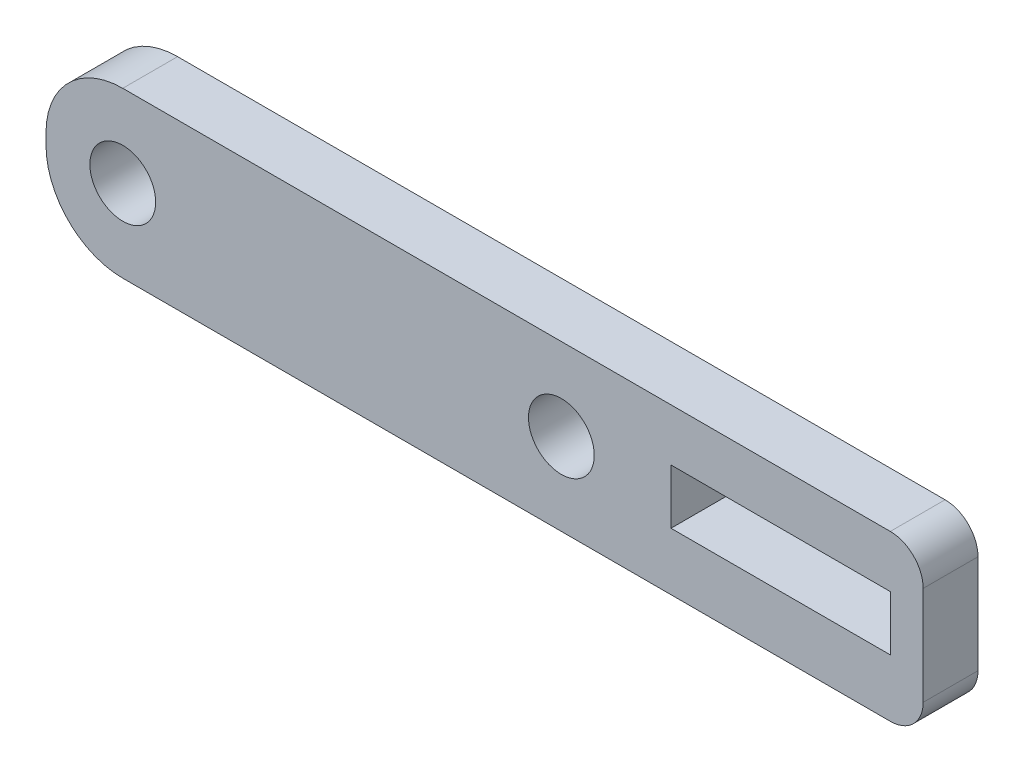
ISO-10303-21;
HEADER;
FILE_DESCRIPTION(('STEP AP214'),'2;1');
FILE_NAME('part.step','',(''),(''),'','','');
FILE_SCHEMA(('AUTOMOTIVE_DESIGN { 1 0 10303 214 1 1 1 1 }'));
ENDSEC;
DATA;
#1=APPLICATION_CONTEXT('core data for automotive mechanical design processes');
#2=APPLICATION_PROTOCOL_DEFINITION('international standard','automotive_design',2000,#1);
#3=PRODUCT_CONTEXT('',#1,'mechanical');
#4=PRODUCT('Part','Part','',(#3));
#5=PRODUCT_RELATED_PRODUCT_CATEGORY('part','',(#4));
#6=PRODUCT_DEFINITION_FORMATION('','',#4);
#7=PRODUCT_DEFINITION_CONTEXT('part definition',#1,'design');
#8=PRODUCT_DEFINITION('design','',#6,#7);
#9=PRODUCT_DEFINITION_SHAPE('','',#8);
#10=(LENGTH_UNIT() NAMED_UNIT(*) SI_UNIT(.MILLI.,.METRE.));
#11=(NAMED_UNIT(*) PLANE_ANGLE_UNIT() SI_UNIT($,.RADIAN.));
#12=(NAMED_UNIT(*) SI_UNIT($,.STERADIAN.) SOLID_ANGLE_UNIT());
#13=UNCERTAINTY_MEASURE_WITH_UNIT(LENGTH_MEASURE(1.E-05),#10,'distance_accuracy_value','');
#14=(GEOMETRIC_REPRESENTATION_CONTEXT(3) GLOBAL_UNCERTAINTY_ASSIGNED_CONTEXT((#13)) GLOBAL_UNIT_ASSIGNED_CONTEXT((#10,
#11,#12)) REPRESENTATION_CONTEXT('',''));
#15=CARTESIAN_POINT('',(0.,0.,0.));
#16=DIRECTION('',(0.,0.,1.));
#17=DIRECTION('',(1.,0.,0.));
#18=AXIS2_PLACEMENT_3D('',#15,#16,#17);
#19=CARTESIAN_POINT('',(80.,0.,5.));
#20=DIRECTION('',(1.,0.,0.));
#21=DIRECTION('',(0.,0.,-1.));
#22=AXIS2_PLACEMENT_3D('',#19,#20,#21);
#23=PLANE('',#22);
#24=DIRECTION('',(0.,-1.,0.));
#25=VECTOR('',#24,1.);
#26=CARTESIAN_POINT('',(80.,0.,0.));
#27=LINE('',#26,#25);
#28=CARTESIAN_POINT('',(80.,12.,0.));
#29=VERTEX_POINT('',#28);
#30=CARTESIAN_POINT('',(80.,3.00000000000002,0.));
#31=VERTEX_POINT('',#30);
#32=EDGE_CURVE('E181',#29,#31,#27,.T.);
#33=ORIENTED_EDGE('',*,*,#32,.F.);
#34=DIRECTION('',(0.,0.,-1.));
#35=VECTOR('',#34,1.);
#36=CARTESIAN_POINT('',(80.,12.,5.));
#37=LINE('',#36,#35);
#38=CARTESIAN_POINT('',(80.,12.,5.));
#39=VERTEX_POINT('',#38);
#40=EDGE_CURVE('E11',#39,#29,#37,.T.);
#41=ORIENTED_EDGE('',*,*,#40,.F.);
#42=DIRECTION('',(0.,-1.,0.));
#43=VECTOR('',#42,1.);
#44=CARTESIAN_POINT('',(80.,0.,5.));
#45=LINE('',#44,#43);
#46=CARTESIAN_POINT('',(80.,3.00000000000002,5.));
#47=VERTEX_POINT('',#46);
#48=EDGE_CURVE('E244',#39,#47,#45,.T.);
#49=ORIENTED_EDGE('',*,*,#48,.T.);
#50=DIRECTION('',(0.,0.,-1.));
#51=VECTOR('',#50,1.);
#52=CARTESIAN_POINT('',(80.,3.00000000000002,5.));
#53=LINE('',#52,#51);
#54=EDGE_CURVE('E100',#47,#31,#53,.T.);
#55=ORIENTED_EDGE('',*,*,#54,.T.);
#56=EDGE_LOOP('',(#33,#41,#49,#55));
#57=FACE_BOUND('',#56,.T.);
#58=ADVANCED_FACE('F34',(#57),#23,.T.);
#59=CARTESIAN_POINT('',(77.,12.,5.));
#60=DIRECTION('',(0.,0.,-1.));
#61=DIRECTION('',(-1.,0.,0.));
#62=AXIS2_PLACEMENT_3D('',#59,#60,#61);
#63=CYLINDRICAL_SURFACE('',#62,3.);
#64=CARTESIAN_POINT('',(77.,12.,0.));
#65=DIRECTION('',(0.,0.,1.));
#66=DIRECTION('',(1.,0.,0.));
#67=AXIS2_PLACEMENT_3D('',#64,#65,#66);
#68=CIRCLE('',#67,3.);
#69=CARTESIAN_POINT('',(77.,15.,0.));
#70=VERTEX_POINT('',#69);
#71=EDGE_CURVE('E183',#29,#70,#68,.T.);
#72=ORIENTED_EDGE('',*,*,#71,.T.);
#73=DIRECTION('',(0.,0.,-1.));
#74=VECTOR('',#73,1.);
#75=CARTESIAN_POINT('',(77.,15.,5.));
#76=LINE('',#75,#74);
#77=CARTESIAN_POINT('',(77.,15.,5.));
#78=VERTEX_POINT('',#77);
#79=EDGE_CURVE('E44',#78,#70,#76,.T.);
#80=ORIENTED_EDGE('',*,*,#79,.F.);
#81=CARTESIAN_POINT('',(77.,12.,5.));
#82=DIRECTION('',(0.,0.,1.));
#83=DIRECTION('',(1.,0.,0.));
#84=AXIS2_PLACEMENT_3D('',#81,#82,#83);
#85=CIRCLE('',#84,3.);
#86=EDGE_CURVE('E246',#39,#78,#85,.T.);
#87=ORIENTED_EDGE('',*,*,#86,.F.);
#88=ORIENTED_EDGE('',*,*,#40,.T.);
#89=EDGE_LOOP('',(#72,#80,#87,#88));
#90=FACE_BOUND('',#89,.T.);
#91=ADVANCED_FACE('F271',(#90),#63,.T.);
#92=CARTESIAN_POINT('',(0.,15.,5.));
#93=DIRECTION('',(0.,1.,0.));
#94=DIRECTION('',(0.,0.,1.));
#95=AXIS2_PLACEMENT_3D('',#92,#93,#94);
#96=PLANE('',#95);
#97=DIRECTION('',(1.,0.,0.));
#98=VECTOR('',#97,1.);
#99=CARTESIAN_POINT('',(0.,15.,0.));
#100=LINE('',#99,#98);
#101=CARTESIAN_POINT('',(7.00000000000005,15.,0.));
#102=VERTEX_POINT('',#101);
#103=EDGE_CURVE('E186',#102,#70,#100,.T.);
#104=ORIENTED_EDGE('',*,*,#103,.F.);
#105=DIRECTION('',(0.,0.,-1.));
#106=VECTOR('',#105,1.);
#107=CARTESIAN_POINT('',(7.00000000000005,15.,5.));
#108=LINE('',#107,#106);
#109=CARTESIAN_POINT('',(7.00000000000005,15.,5.));
#110=VERTEX_POINT('',#109);
#111=EDGE_CURVE('E205',#110,#102,#108,.T.);
#112=ORIENTED_EDGE('',*,*,#111,.F.);
#113=DIRECTION('',(1.,0.,0.));
#114=VECTOR('',#113,1.);
#115=CARTESIAN_POINT('',(0.,15.,5.));
#116=LINE('',#115,#114);
#117=EDGE_CURVE('E248',#110,#78,#116,.T.);
#118=ORIENTED_EDGE('',*,*,#117,.T.);
#119=ORIENTED_EDGE('',*,*,#79,.T.);
#120=EDGE_LOOP('',(#104,#112,#118,#119));
#121=FACE_BOUND('',#120,.T.);
#122=ADVANCED_FACE('F276',(#121),#96,.T.);
#123=CARTESIAN_POINT('',(7.,8.,5.));
#124=DIRECTION('',(0.,0.,-1.));
#125=DIRECTION('',(-1.,0.,0.));
#126=AXIS2_PLACEMENT_3D('',#123,#124,#125);
#127=CYLINDRICAL_SURFACE('',#126,7.);
#128=CARTESIAN_POINT('',(7.,8.,0.));
#129=DIRECTION('',(0.,0.,1.));
#130=DIRECTION('',(1.,0.,0.));
#131=AXIS2_PLACEMENT_3D('',#128,#129,#130);
#132=CIRCLE('',#131,7.);
#133=CARTESIAN_POINT('',(0.,7.99999999999995,0.));
#134=VERTEX_POINT('',#133);
#135=EDGE_CURVE('E189',#134,#102,#132,.F.);
#136=ORIENTED_EDGE('',*,*,#135,.F.);
#137=DIRECTION('',(0.,0.,-1.));
#138=VECTOR('',#137,1.);
#139=CARTESIAN_POINT('',(0.,7.99999999999995,5.));
#140=LINE('',#139,#138);
#141=CARTESIAN_POINT('',(0.,7.99999999999995,5.));
#142=VERTEX_POINT('',#141);
#143=EDGE_CURVE('E203',#142,#134,#140,.T.);
#144=ORIENTED_EDGE('',*,*,#143,.F.);
#145=CARTESIAN_POINT('',(7.,8.,5.));
#146=DIRECTION('',(0.,0.,1.));
#147=DIRECTION('',(1.,0.,0.));
#148=AXIS2_PLACEMENT_3D('',#145,#146,#147);
#149=CIRCLE('',#148,7.);
#150=EDGE_CURVE('E157',#142,#110,#149,.F.);
#151=ORIENTED_EDGE('',*,*,#150,.T.);
#152=ORIENTED_EDGE('',*,*,#111,.T.);
#153=EDGE_LOOP('',(#136,#144,#151,#152));
#154=FACE_BOUND('',#153,.T.);
#155=ADVANCED_FACE('F253',(#154),#127,.T.);
#156=CARTESIAN_POINT('',(0.,0.,5.));
#157=DIRECTION('',(-1.,0.,0.));
#158=DIRECTION('',(0.,0.,1.));
#159=AXIS2_PLACEMENT_3D('',#156,#157,#158);
#160=PLANE('',#159);
#161=DIRECTION('',(0.,1.,0.));
#162=VECTOR('',#161,1.);
#163=CARTESIAN_POINT('',(0.,0.,0.));
#164=LINE('',#163,#162);
#165=CARTESIAN_POINT('',(0.,7.00000000000005,0.));
#166=VERTEX_POINT('',#165);
#167=EDGE_CURVE('E192',#166,#134,#164,.T.);
#168=ORIENTED_EDGE('',*,*,#167,.F.);
#169=DIRECTION('',(0.,0.,-1.));
#170=VECTOR('',#169,1.);
#171=CARTESIAN_POINT('',(0.,7.00000000000005,5.));
#172=LINE('',#171,#170);
#173=CARTESIAN_POINT('',(0.,7.00000000000005,5.));
#174=VERTEX_POINT('',#173);
#175=EDGE_CURVE('E144',#174,#166,#172,.T.);
#176=ORIENTED_EDGE('',*,*,#175,.F.);
#177=DIRECTION('',(0.,1.,0.));
#178=VECTOR('',#177,1.);
#179=CARTESIAN_POINT('',(0.,0.,5.));
#180=LINE('',#179,#178);
#181=EDGE_CURVE('E155',#174,#142,#180,.T.);
#182=ORIENTED_EDGE('',*,*,#181,.T.);
#183=ORIENTED_EDGE('',*,*,#143,.T.);
#184=EDGE_LOOP('',(#168,#176,#182,#183));
#185=FACE_BOUND('',#184,.T.);
#186=ADVANCED_FACE('F258',(#185),#160,.T.);
#187=CARTESIAN_POINT('',(7.,7.,5.));
#188=DIRECTION('',(0.,0.,-1.));
#189=DIRECTION('',(-1.,0.,0.));
#190=AXIS2_PLACEMENT_3D('',#187,#188,#189);
#191=CYLINDRICAL_SURFACE('',#190,7.);
#192=CARTESIAN_POINT('',(7.,7.,0.));
#193=DIRECTION('',(0.,0.,1.));
#194=DIRECTION('',(1.,0.,0.));
#195=AXIS2_PLACEMENT_3D('',#192,#193,#194);
#196=CIRCLE('',#195,7.);
#197=CARTESIAN_POINT('',(7.00000000000005,0.,0.));
#198=VERTEX_POINT('',#197);
#199=EDGE_CURVE('E141',#198,#166,#196,.F.);
#200=ORIENTED_EDGE('',*,*,#199,.F.);
#201=DIRECTION('',(0.,0.,-1.));
#202=VECTOR('',#201,1.);
#203=CARTESIAN_POINT('',(7.00000000000005,0.,5.));
#204=LINE('',#203,#202);
#205=CARTESIAN_POINT('',(7.00000000000005,0.,5.));
#206=VERTEX_POINT('',#205);
#207=EDGE_CURVE('E135',#206,#198,#204,.T.);
#208=ORIENTED_EDGE('',*,*,#207,.F.);
#209=CARTESIAN_POINT('',(7.,7.,5.));
#210=DIRECTION('',(0.,0.,1.));
#211=DIRECTION('',(1.,0.,0.));
#212=AXIS2_PLACEMENT_3D('',#209,#210,#211);
#213=CIRCLE('',#212,7.);
#214=EDGE_CURVE('E139',#206,#174,#213,.F.);
#215=ORIENTED_EDGE('',*,*,#214,.T.);
#216=ORIENTED_EDGE('',*,*,#175,.T.);
#217=EDGE_LOOP('',(#200,#208,#215,#216));
#218=FACE_BOUND('',#217,.T.);
#219=ADVANCED_FACE('F137',(#218),#191,.T.);
#220=CARTESIAN_POINT('',(0.,0.,5.));
#221=DIRECTION('',(0.,1.,0.));
#222=DIRECTION('',(0.,0.,1.));
#223=AXIS2_PLACEMENT_3D('',#220,#221,#222);
#224=PLANE('',#223);
#225=DIRECTION('',(1.,0.,0.));
#226=VECTOR('',#225,1.);
#227=CARTESIAN_POINT('',(0.,0.,0.));
#228=LINE('',#227,#226);
#229=CARTESIAN_POINT('',(77.,0.,0.));
#230=VERTEX_POINT('',#229);
#231=EDGE_CURVE('E196',#198,#230,#228,.T.);
#232=ORIENTED_EDGE('',*,*,#231,.T.);
#233=DIRECTION('',(0.,0.,-1.));
#234=VECTOR('',#233,1.);
#235=CARTESIAN_POINT('',(77.,0.,5.));
#236=LINE('',#235,#234);
#237=CARTESIAN_POINT('',(77.,0.,5.));
#238=VERTEX_POINT('',#237);
#239=EDGE_CURVE('E145',#238,#230,#236,.T.);
#240=ORIENTED_EDGE('',*,*,#239,.F.);
#241=DIRECTION('',(1.,0.,0.));
#242=VECTOR('',#241,1.);
#243=CARTESIAN_POINT('',(0.,0.,5.));
#244=LINE('',#243,#242);
#245=EDGE_CURVE('E148',#206,#238,#244,.T.);
#246=ORIENTED_EDGE('',*,*,#245,.F.);
#247=ORIENTED_EDGE('',*,*,#207,.T.);
#248=EDGE_LOOP('',(#232,#240,#246,#247));
#249=FACE_BOUND('',#248,.T.);
#250=ADVANCED_FACE('F149',(#249),#224,.F.);
#251=CARTESIAN_POINT('',(57.,0.,5.));
#252=DIRECTION('',(1.,0.,0.));
#253=DIRECTION('',(0.,0.,-1.));
#254=AXIS2_PLACEMENT_3D('',#251,#252,#253);
#255=PLANE('',#254);
#256=DIRECTION('',(0.,-1.,0.));
#257=VECTOR('',#256,1.);
#258=CARTESIAN_POINT('',(57.,0.,0.));
#259=LINE('',#258,#257);
#260=CARTESIAN_POINT('',(57.,10.25,0.));
#261=VERTEX_POINT('',#260);
#262=CARTESIAN_POINT('',(57.,5.25000000000002,0.));
#263=VERTEX_POINT('',#262);
#264=EDGE_CURVE('E166',#261,#263,#259,.T.);
#265=ORIENTED_EDGE('',*,*,#264,.F.);
#266=DIRECTION('',(0.,0.,-1.));
#267=VECTOR('',#266,1.);
#268=CARTESIAN_POINT('',(57.,10.25,5.));
#269=LINE('',#268,#267);
#270=CARTESIAN_POINT('',(57.,10.25,5.));
#271=VERTEX_POINT('',#270);
#272=EDGE_CURVE('E38',#271,#261,#269,.T.);
#273=ORIENTED_EDGE('',*,*,#272,.F.);
#274=DIRECTION('',(0.,-1.,0.));
#275=VECTOR('',#274,1.);
#276=CARTESIAN_POINT('',(57.,0.,5.));
#277=LINE('',#276,#275);
#278=CARTESIAN_POINT('',(57.,5.25000000000002,5.));
#279=VERTEX_POINT('',#278);
#280=EDGE_CURVE('E238',#271,#279,#277,.T.);
#281=ORIENTED_EDGE('',*,*,#280,.T.);
#282=DIRECTION('',(0.,0.,-1.));
#283=VECTOR('',#282,1.);
#284=CARTESIAN_POINT('',(57.,5.25000000000002,5.));
#285=LINE('',#284,#283);
#286=EDGE_CURVE('E162',#279,#263,#285,.T.);
#287=ORIENTED_EDGE('',*,*,#286,.T.);
#288=EDGE_LOOP('',(#265,#273,#281,#287));
#289=FACE_BOUND('',#288,.T.);
#290=ADVANCED_FACE('F221',(#289),#255,.T.);
#291=CARTESIAN_POINT('',(0.,10.25,5.));
#292=DIRECTION('',(0.,-1.,0.));
#293=DIRECTION('',(1.,0.,0.));
#294=AXIS2_PLACEMENT_3D('',#291,#292,#293);
#295=PLANE('',#294);
#296=DIRECTION('',(-1.,0.,0.));
#297=VECTOR('',#296,1.);
#298=CARTESIAN_POINT('',(0.,10.25,0.));
#299=LINE('',#298,#297);
#300=CARTESIAN_POINT('',(77.,10.25,0.));
#301=VERTEX_POINT('',#300);
#302=EDGE_CURVE('E169',#301,#261,#299,.T.);
#303=ORIENTED_EDGE('',*,*,#302,.F.);
#304=DIRECTION('',(0.,0.,-1.));
#305=VECTOR('',#304,1.);
#306=CARTESIAN_POINT('',(77.,10.25,5.));
#307=LINE('',#306,#305);
#308=CARTESIAN_POINT('',(77.,10.25,5.));
#309=VERTEX_POINT('',#308);
#310=EDGE_CURVE('E211',#309,#301,#307,.T.);
#311=ORIENTED_EDGE('',*,*,#310,.F.);
#312=DIRECTION('',(-1.,0.,0.));
#313=VECTOR('',#312,1.);
#314=CARTESIAN_POINT('',(0.,10.25,5.));
#315=LINE('',#314,#313);
#316=EDGE_CURVE('E220',#309,#271,#315,.T.);
#317=ORIENTED_EDGE('',*,*,#316,.T.);
#318=ORIENTED_EDGE('',*,*,#272,.T.);
#319=EDGE_LOOP('',(#303,#311,#317,#318));
#320=FACE_BOUND('',#319,.T.);
#321=ADVANCED_FACE('F218',(#320),#295,.T.);
#322=CARTESIAN_POINT('',(77.,0.,5.));
#323=DIRECTION('',(1.,0.,0.));
#324=DIRECTION('',(0.,0.,-1.));
#325=AXIS2_PLACEMENT_3D('',#322,#323,#324);
#326=PLANE('',#325);
#327=DIRECTION('',(0.,-1.,0.));
#328=VECTOR('',#327,1.);
#329=CARTESIAN_POINT('',(77.,0.,0.));
#330=LINE('',#329,#328);
#331=CARTESIAN_POINT('',(77.,5.25000000000001,0.));
#332=VERTEX_POINT('',#331);
#333=EDGE_CURVE('E172',#301,#332,#330,.T.);
#334=ORIENTED_EDGE('',*,*,#333,.T.);
#335=DIRECTION('',(0.,0.,-1.));
#336=VECTOR('',#335,1.);
#337=CARTESIAN_POINT('',(77.,5.25000000000001,5.));
#338=LINE('',#337,#336);
#339=CARTESIAN_POINT('',(77.,5.25000000000001,5.));
#340=VERTEX_POINT('',#339);
#341=EDGE_CURVE('E209',#340,#332,#338,.T.);
#342=ORIENTED_EDGE('',*,*,#341,.F.);
#343=DIRECTION('',(0.,-1.,0.));
#344=VECTOR('',#343,1.);
#345=CARTESIAN_POINT('',(77.,0.,5.));
#346=LINE('',#345,#344);
#347=EDGE_CURVE('E229',#309,#340,#346,.T.);
#348=ORIENTED_EDGE('',*,*,#347,.F.);
#349=ORIENTED_EDGE('',*,*,#310,.T.);
#350=EDGE_LOOP('',(#334,#342,#348,#349));
#351=FACE_BOUND('',#350,.T.);
#352=ADVANCED_FACE('F227',(#351),#326,.F.);
#353=CARTESIAN_POINT('',(7.,7.5,5.));
#354=DIRECTION('',(0.,0.,-1.));
#355=DIRECTION('',(-1.,0.,0.));
#356=AXIS2_PLACEMENT_3D('',#353,#354,#355);
#357=CYLINDRICAL_SURFACE('',#356,3.);
#358=CARTESIAN_POINT('',(7.,7.5,5.));
#359=DIRECTION('',(0.,0.,1.));
#360=DIRECTION('',(1.,0.,0.));
#361=AXIS2_PLACEMENT_3D('',#358,#359,#360);
#362=CIRCLE('',#361,3.);
#363=CARTESIAN_POINT('',(10.,7.5,5.));
#364=VERTEX_POINT('',#363);
#365=EDGE_CURVE('E234',#364,#364,#362,.T.);
#366=ORIENTED_EDGE('',*,*,#365,.T.);
#367=EDGE_LOOP('',(#366));
#368=FACE_BOUND('',#367,.T.);
#369=CARTESIAN_POINT('',(7.,7.5,0.));
#370=DIRECTION('',(0.,0.,1.));
#371=DIRECTION('',(1.,0.,0.));
#372=AXIS2_PLACEMENT_3D('',#369,#370,#371);
#373=CIRCLE('',#372,3.);
#374=CARTESIAN_POINT('',(10.,7.5,0.));
#375=VERTEX_POINT('',#374);
#376=EDGE_CURVE('E178',#375,#375,#373,.T.);
#377=ORIENTED_EDGE('',*,*,#376,.F.);
#378=EDGE_LOOP('',(#377));
#379=FACE_BOUND('',#378,.T.);
#380=ADVANCED_FACE('F281',(#368,#379),#357,.F.);
#381=CARTESIAN_POINT('',(0.,5.25000000000004,5.));
#382=DIRECTION('',(0.,-1.,0.));
#383=DIRECTION('',(1.,0.,0.));
#384=AXIS2_PLACEMENT_3D('',#381,#382,#383);
#385=PLANE('',#384);
#386=DIRECTION('',(-1.,0.,0.));
#387=VECTOR('',#386,1.);
#388=CARTESIAN_POINT('',(0.,5.25000000000004,0.));
#389=LINE('',#388,#387);
#390=EDGE_CURVE('E175',#332,#263,#389,.T.);
#391=ORIENTED_EDGE('',*,*,#390,.T.);
#392=ORIENTED_EDGE('',*,*,#286,.F.);
#393=DIRECTION('',(-1.,0.,0.));
#394=VECTOR('',#393,1.);
#395=CARTESIAN_POINT('',(0.,5.25000000000004,5.));
#396=LINE('',#395,#394);
#397=EDGE_CURVE('E232',#340,#279,#396,.T.);
#398=ORIENTED_EDGE('',*,*,#397,.F.);
#399=ORIENTED_EDGE('',*,*,#341,.T.);
#400=EDGE_LOOP('',(#391,#392,#398,#399));
#401=FACE_BOUND('',#400,.T.);
#402=ADVANCED_FACE('F231',(#401),#385,.F.);
#403=CARTESIAN_POINT('',(47.,7.5,5.));
#404=DIRECTION('',(0.,0.,-1.));
#405=DIRECTION('',(-1.,0.,0.));
#406=AXIS2_PLACEMENT_3D('',#403,#404,#405);
#407=CYLINDRICAL_SURFACE('',#406,3.);
#408=CARTESIAN_POINT('',(47.,7.5,5.));
#409=DIRECTION('',(0.,0.,1.));
#410=DIRECTION('',(1.,0.,0.));
#411=AXIS2_PLACEMENT_3D('',#408,#409,#410);
#412=CIRCLE('',#411,3.);
#413=CARTESIAN_POINT('',(50.,7.5,5.));
#414=VERTEX_POINT('',#413);
#415=EDGE_CURVE('E199',#414,#414,#412,.T.);
#416=ORIENTED_EDGE('',*,*,#415,.T.);
#417=EDGE_LOOP('',(#416));
#418=FACE_BOUND('',#417,.T.);
#419=CARTESIAN_POINT('',(47.,7.5,0.));
#420=DIRECTION('',(0.,0.,1.));
#421=DIRECTION('',(1.,0.,0.));
#422=AXIS2_PLACEMENT_3D('',#419,#420,#421);
#423=CIRCLE('',#422,3.);
#424=CARTESIAN_POINT('',(50.,7.5,0.));
#425=VERTEX_POINT('',#424);
#426=EDGE_CURVE('E163',#425,#425,#423,.T.);
#427=ORIENTED_EDGE('',*,*,#426,.F.);
#428=EDGE_LOOP('',(#427));
#429=FACE_BOUND('',#428,.T.);
#430=ADVANCED_FACE('F36',(#418,#429),#407,.F.);
#431=CARTESIAN_POINT('',(77.,3.,5.));
#432=DIRECTION('',(0.,0.,-1.));
#433=DIRECTION('',(-1.,0.,0.));
#434=AXIS2_PLACEMENT_3D('',#431,#432,#433);
#435=CYLINDRICAL_SURFACE('',#434,3.);
#436=CARTESIAN_POINT('',(77.,3.,0.));
#437=DIRECTION('',(0.,0.,1.));
#438=DIRECTION('',(1.,0.,0.));
#439=AXIS2_PLACEMENT_3D('',#436,#437,#438);
#440=CIRCLE('',#439,3.);
#441=EDGE_CURVE('E93',#230,#31,#440,.T.);
#442=ORIENTED_EDGE('',*,*,#441,.T.);
#443=ORIENTED_EDGE('',*,*,#54,.F.);
#444=CARTESIAN_POINT('',(77.,3.,5.));
#445=DIRECTION('',(0.,0.,1.));
#446=DIRECTION('',(1.,0.,0.));
#447=AXIS2_PLACEMENT_3D('',#444,#445,#446);
#448=CIRCLE('',#447,3.);
#449=EDGE_CURVE('E53',#238,#47,#448,.T.);
#450=ORIENTED_EDGE('',*,*,#449,.F.);
#451=ORIENTED_EDGE('',*,*,#239,.T.);
#452=EDGE_LOOP('',(#442,#443,#450,#451));
#453=FACE_BOUND('',#452,.T.);
#454=ADVANCED_FACE('F266',(#453),#435,.T.);
#455=CARTESIAN_POINT('',(0.,0.,5.));
#456=DIRECTION('',(0.,0.,1.));
#457=DIRECTION('',(1.,0.,0.));
#458=AXIS2_PLACEMENT_3D('',#455,#456,#457);
#459=PLANE('',#458);
#460=ORIENTED_EDGE('',*,*,#415,.F.);
#461=EDGE_LOOP('',(#460));
#462=FACE_BOUND('',#461,.T.);
#463=ORIENTED_EDGE('',*,*,#280,.F.);
#464=ORIENTED_EDGE('',*,*,#316,.F.);
#465=ORIENTED_EDGE('',*,*,#347,.T.);
#466=ORIENTED_EDGE('',*,*,#397,.T.);
#467=EDGE_LOOP('',(#463,#464,#465,#466));
#468=FACE_BOUND('',#467,.T.);
#469=ORIENTED_EDGE('',*,*,#365,.F.);
#470=EDGE_LOOP('',(#469));
#471=FACE_BOUND('',#470,.T.);
#472=ORIENTED_EDGE('',*,*,#48,.F.);
#473=ORIENTED_EDGE('',*,*,#86,.T.);
#474=ORIENTED_EDGE('',*,*,#117,.F.);
#475=ORIENTED_EDGE('',*,*,#150,.F.);
#476=ORIENTED_EDGE('',*,*,#181,.F.);
#477=ORIENTED_EDGE('',*,*,#214,.F.);
#478=ORIENTED_EDGE('',*,*,#245,.T.);
#479=ORIENTED_EDGE('',*,*,#449,.T.);
#480=EDGE_LOOP('',(#472,#473,#474,#475,#476,#477,#478,#479));
#481=FACE_BOUND('',#480,.T.);
#482=ADVANCED_FACE('F152',(#462,#468,#471,#481),#459,.T.);
#483=CARTESIAN_POINT('',(0.,0.,0.));
#484=DIRECTION('',(0.,0.,1.));
#485=DIRECTION('',(1.,0.,0.));
#486=AXIS2_PLACEMENT_3D('',#483,#484,#485);
#487=PLANE('',#486);
#488=ORIENTED_EDGE('',*,*,#426,.T.);
#489=EDGE_LOOP('',(#488));
#490=FACE_BOUND('',#489,.T.);
#491=ORIENTED_EDGE('',*,*,#264,.T.);
#492=ORIENTED_EDGE('',*,*,#390,.F.);
#493=ORIENTED_EDGE('',*,*,#333,.F.);
#494=ORIENTED_EDGE('',*,*,#302,.T.);
#495=EDGE_LOOP('',(#491,#492,#493,#494));
#496=FACE_BOUND('',#495,.T.);
#497=ORIENTED_EDGE('',*,*,#376,.T.);
#498=EDGE_LOOP('',(#497));
#499=FACE_BOUND('',#498,.T.);
#500=ORIENTED_EDGE('',*,*,#32,.T.);
#501=ORIENTED_EDGE('',*,*,#441,.F.);
#502=ORIENTED_EDGE('',*,*,#231,.F.);
#503=ORIENTED_EDGE('',*,*,#199,.T.);
#504=ORIENTED_EDGE('',*,*,#167,.T.);
#505=ORIENTED_EDGE('',*,*,#135,.T.);
#506=ORIENTED_EDGE('',*,*,#103,.T.);
#507=ORIENTED_EDGE('',*,*,#71,.F.);
#508=EDGE_LOOP('',(#500,#501,#502,#503,#504,#505,#506,#507));
#509=FACE_BOUND('',#508,.T.);
#510=ADVANCED_FACE('F224',(#490,#496,#499,#509),#487,.F.);
#511=CLOSED_SHELL('',(#58,#91,#122,#155,#186,#219,#250,#290,#321,#352,#380,#402,#430,#454,#482,#510));
#512=MANIFOLD_SOLID_BREP('B2',#511);
#513=ADVANCED_BREP_SHAPE_REPRESENTATION('',(#18,#512),#14);
#514=SHAPE_DEFINITION_REPRESENTATION(#9,#513);
ENDSEC;
END-ISO-10303-21;
